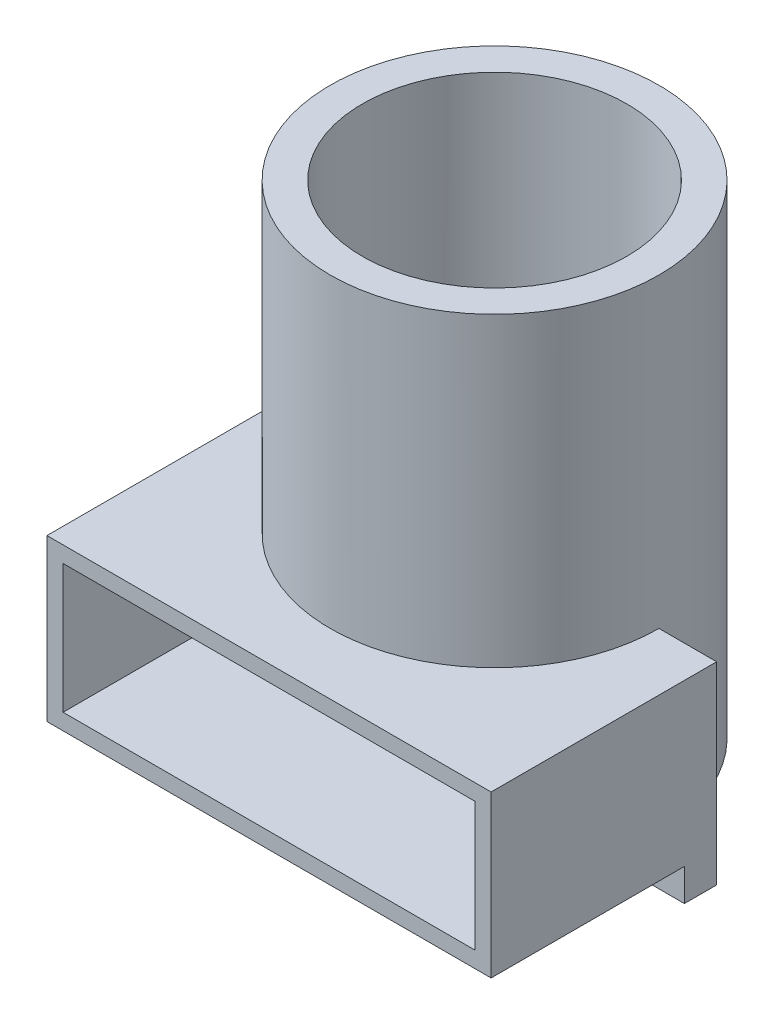
ISO-10303-21;
HEADER;
FILE_DESCRIPTION(('STEP AP214'),'2;1');
FILE_NAME('part.step','',(''),(''),'','','');
FILE_SCHEMA(('AUTOMOTIVE_DESIGN { 1 0 10303 214 1 1 1 1 }'));
ENDSEC;
DATA;
#1=APPLICATION_CONTEXT('core data for automotive mechanical design processes');
#2=APPLICATION_PROTOCOL_DEFINITION('international standard','automotive_design',2000,#1);
#3=PRODUCT_CONTEXT('',#1,'mechanical');
#4=PRODUCT('Part','Part','',(#3));
#5=PRODUCT_RELATED_PRODUCT_CATEGORY('part','',(#4));
#6=PRODUCT_DEFINITION_FORMATION('','',#4);
#7=PRODUCT_DEFINITION_CONTEXT('part definition',#1,'design');
#8=PRODUCT_DEFINITION('design','',#6,#7);
#9=PRODUCT_DEFINITION_SHAPE('','',#8);
#10=(LENGTH_UNIT() NAMED_UNIT(*) SI_UNIT(.MILLI.,.METRE.));
#11=(NAMED_UNIT(*) PLANE_ANGLE_UNIT() SI_UNIT($,.RADIAN.));
#12=(NAMED_UNIT(*) SI_UNIT($,.STERADIAN.) SOLID_ANGLE_UNIT());
#13=UNCERTAINTY_MEASURE_WITH_UNIT(LENGTH_MEASURE(1.E-05),#10,'distance_accuracy_value','');
#14=(GEOMETRIC_REPRESENTATION_CONTEXT(3) GLOBAL_UNCERTAINTY_ASSIGNED_CONTEXT((#13)) GLOBAL_UNIT_ASSIGNED_CONTEXT((#10,
#11,#12)) REPRESENTATION_CONTEXT('',''));
#15=CARTESIAN_POINT('',(0.,0.,0.));
#16=DIRECTION('',(0.,0.,1.));
#17=DIRECTION('',(1.,0.,0.));
#18=AXIS2_PLACEMENT_3D('',#15,#16,#17);
#19=CARTESIAN_POINT('',(-350.139,-254.,355.6));
#20=DIRECTION('',(0.,1.,0.));
#21=DIRECTION('',(0.,0.,1.));
#22=AXIS2_PLACEMENT_3D('',#19,#20,#21);
#23=PLANE('',#22);
#24=DIRECTION('',(-1.,0.,0.));
#25=VECTOR('',#24,1.);
#26=CARTESIAN_POINT('',(-350.139,-254.,50.8));
#27=LINE('',#26,#25);
#28=CARTESIAN_POINT('',(350.139,-254.,50.8000000000001));
#29=VERTEX_POINT('',#28);
#30=CARTESIAN_POINT('',(-350.139,-254.,50.8));
#31=VERTEX_POINT('',#30);
#32=EDGE_CURVE('E75',#29,#31,#27,.T.);
#33=ORIENTED_EDGE('',*,*,#32,.F.);
#34=DIRECTION('',(0.,0.,-1.));
#35=VECTOR('',#34,1.);
#36=CARTESIAN_POINT('',(350.139,-254.,355.6));
#37=LINE('',#36,#35);
#38=CARTESIAN_POINT('',(350.139,-254.,355.6));
#39=VERTEX_POINT('',#38);
#40=EDGE_CURVE('E247',#39,#29,#37,.T.);
#41=ORIENTED_EDGE('',*,*,#40,.F.);
#42=DIRECTION('',(1.,0.,0.));
#43=VECTOR('',#42,1.);
#44=CARTESIAN_POINT('',(-350.139,-254.,355.6));
#45=LINE('',#44,#43);
#46=CARTESIAN_POINT('',(-350.139,-254.,355.6));
#47=VERTEX_POINT('',#46);
#48=EDGE_CURVE('E232',#47,#39,#45,.T.);
#49=ORIENTED_EDGE('',*,*,#48,.F.);
#50=DIRECTION('',(0.,0.,-1.));
#51=VECTOR('',#50,1.);
#52=CARTESIAN_POINT('',(-350.139,-254.,355.6));
#53=LINE('',#52,#51);
#54=EDGE_CURVE('E71',#47,#31,#53,.T.);
#55=ORIENTED_EDGE('',*,*,#54,.T.);
#56=EDGE_LOOP('',(#33,#41,#49,#55));
#57=FACE_BOUND('',#56,.T.);
#58=ADVANCED_FACE('F51',(#57),#23,.F.);
#59=CARTESIAN_POINT('',(0.,482.6,0.));
#60=DIRECTION('',(0.,1.,0.));
#61=DIRECTION('',(0.,0.,1.));
#62=AXIS2_PLACEMENT_3D('',#59,#60,#61);
#63=PLANE('',#62);
#64=CARTESIAN_POINT('',(0.,482.6,0.));
#65=DIRECTION('',(0.,1.,0.));
#66=DIRECTION('',(0.,0.,1.));
#67=AXIS2_PLACEMENT_3D('',#64,#65,#66);
#68=CIRCLE('',#67,259.207);
#69=CARTESIAN_POINT('',(0.,482.6,259.207));
#70=VERTEX_POINT('',#69);
#71=EDGE_CURVE('E274',#70,#70,#68,.T.);
#72=ORIENTED_EDGE('',*,*,#71,.T.);
#73=EDGE_LOOP('',(#72));
#74=FACE_BOUND('',#73,.T.);
#75=CARTESIAN_POINT('',(0.,482.6,0.));
#76=DIRECTION('',(0.,1.,0.));
#77=DIRECTION('',(1.,0.,0.));
#78=AXIS2_PLACEMENT_3D('',#75,#76,#77);
#79=CIRCLE('',#78,208.407);
#80=CARTESIAN_POINT('',(208.407,482.6,0.));
#81=VERTEX_POINT('',#80);
#82=EDGE_CURVE('E268',#81,#81,#79,.T.);
#83=ORIENTED_EDGE('',*,*,#82,.F.);
#84=EDGE_LOOP('',(#83));
#85=FACE_BOUND('',#84,.T.);
#86=ADVANCED_FACE('F297',(#74,#85),#63,.T.);
#87=CARTESIAN_POINT('',(0.,482.6,0.));
#88=DIRECTION('',(0.,-1.,0.));
#89=DIRECTION('',(0.,0.,-1.));
#90=AXIS2_PLACEMENT_3D('',#87,#88,#89);
#91=CYLINDRICAL_SURFACE('',#90,259.207);
#92=ORIENTED_EDGE('',*,*,#71,.F.);
#93=EDGE_LOOP('',(#92));
#94=FACE_BOUND('',#93,.T.);
#95=CARTESIAN_POINT('',(0.,0.,0.));
#96=DIRECTION('',(0.,1.,0.));
#97=DIRECTION('',(0.,0.,1.));
#98=AXIS2_PLACEMENT_3D('',#95,#96,#97);
#99=CIRCLE('',#98,259.207);
#100=CARTESIAN_POINT('',(-259.207,0.,0.));
#101=VERTEX_POINT('',#100);
#102=CARTESIAN_POINT('',(259.207,0.,0.));
#103=VERTEX_POINT('',#102);
#104=EDGE_CURVE('E271',#101,#103,#99,.T.);
#105=ORIENTED_EDGE('',*,*,#104,.T.);
#106=DIRECTION('',(0.,1.,0.));
#107=VECTOR('',#106,1.);
#108=CARTESIAN_POINT('',(259.207,-279.4,0.));
#109=LINE('',#108,#107);
#110=CARTESIAN_POINT('',(259.207,-279.4,0.));
#111=VERTEX_POINT('',#110);
#112=EDGE_CURVE('E260',#111,#103,#109,.T.);
#113=ORIENTED_EDGE('',*,*,#112,.F.);
#114=CARTESIAN_POINT('',(0.,-279.4,0.));
#115=DIRECTION('',(0.,1.,0.));
#116=DIRECTION('',(1.,0.,0.));
#117=AXIS2_PLACEMENT_3D('',#114,#115,#116);
#118=CIRCLE('',#117,259.207);
#119=CARTESIAN_POINT('',(-259.207,-279.4,0.));
#120=VERTEX_POINT('',#119);
#121=EDGE_CURVE('E250',#111,#120,#118,.T.);
#122=ORIENTED_EDGE('',*,*,#121,.T.);
#123=DIRECTION('',(0.,1.,0.));
#124=VECTOR('',#123,1.);
#125=CARTESIAN_POINT('',(-259.207,-279.4,0.));
#126=LINE('',#125,#124);
#127=EDGE_CURVE('E259',#120,#101,#126,.T.);
#128=ORIENTED_EDGE('',*,*,#127,.T.);
#129=EDGE_LOOP('',(#105,#113,#122,#128));
#130=FACE_BOUND('',#129,.T.);
#131=ADVANCED_FACE('F294',(#94,#130),#91,.T.);
#132=CARTESIAN_POINT('',(0.,482.6,0.));
#133=DIRECTION('',(0.,-1.,0.));
#134=DIRECTION('',(0.,0.,-1.));
#135=AXIS2_PLACEMENT_3D('',#132,#133,#134);
#136=CYLINDRICAL_SURFACE('',#135,208.407);
#137=ORIENTED_EDGE('',*,*,#82,.T.);
#138=EDGE_LOOP('',(#137));
#139=FACE_BOUND('',#138,.T.);
#140=CARTESIAN_POINT('',(0.,0.,0.));
#141=DIRECTION('',(0.,1.,0.));
#142=DIRECTION('',(1.,0.,0.));
#143=AXIS2_PLACEMENT_3D('',#140,#141,#142);
#144=CIRCLE('',#143,208.407);
#145=CARTESIAN_POINT('',(-165.240665845306,0.,127.));
#146=VERTEX_POINT('',#145);
#147=CARTESIAN_POINT('',(165.240665845306,0.,127.));
#148=VERTEX_POINT('',#147);
#149=EDGE_CURVE('E262',#146,#148,#144,.T.);
#150=ORIENTED_EDGE('',*,*,#149,.F.);
#151=CARTESIAN_POINT('',(-165.240665845306,0.,127.));
#152=CARTESIAN_POINT('',(-166.311932556841,1.21420941249425E-05,125.606218523947));
#153=CARTESIAN_POINT('',(-167.365561715632,-0.0229447270909377,124.198784595822));
#154=CARTESIAN_POINT('',(-169.436248679135,-0.117403101078186,121.35864475642));
#155=CARTESIAN_POINT('',(-170.45330248051,-0.188909902964799,119.925936104136));
#156=CARTESIAN_POINT('',(-172.450099983005,-0.383152929945619,117.036438922352));
#157=CARTESIAN_POINT('',(-173.429813438047,-0.505929760738702,115.579632187488));
#158=CARTESIAN_POINT('',(-175.349675353412,-0.8052025581327,112.64564860846));
#159=CARTESIAN_POINT('',(-176.289825040983,-0.981696857045053,111.168472398037));
#160=CARTESIAN_POINT('',(-178.131706379324,-1.39130525163969,108.192619600541));
#161=CARTESIAN_POINT('',(-179.033330381572,-1.62456717293259,106.693896651353));
#162=CARTESIAN_POINT('',(-180.794289036789,-2.1496690869607,103.681945354611));
#163=CARTESIAN_POINT('',(-181.653624382415,-2.44150811984875,102.168717245126));
#164=CARTESIAN_POINT('',(-183.328723013307,-3.08568063064286,99.1315477465516));
#165=CARTESIAN_POINT('',(-184.14449716591,-3.43799892729679,97.6076091378119));
#166=CARTESIAN_POINT('',(-185.731779651966,-4.20492379997948,94.5523514245955));
#167=CARTESIAN_POINT('',(-186.503288073273,-4.61953025237883,93.0210323347735));
#168=CARTESIAN_POINT('',(-188.005393029706,-5.51492408139061,89.9466108711078));
#169=CARTESIAN_POINT('',(-188.735744008245,-5.99605941791235,88.4034897297044));
#170=CARTESIAN_POINT('',(-190.150459698756,-7.02394050163346,85.3179978200432));
#171=CARTESIAN_POINT('',(-190.834824321949,-7.57068637549255,83.7756270532398));
#172=CARTESIAN_POINT('',(-192.157388739441,-8.73066356069948,80.6958760423355));
#173=CARTESIAN_POINT('',(-192.795583764303,-9.34390172456619,79.1584963294468));
#174=CARTESIAN_POINT('',(-194.025765968894,-10.6372662950916,76.0934086076228));
#175=CARTESIAN_POINT('',(-194.617753254785,-11.3173925480686,74.5657005764744));
#176=CARTESIAN_POINT('',(-195.754601459759,-12.7430384393218,71.5278834139279));
#177=CARTESIAN_POINT('',(-196.299563226365,-13.4884108669848,70.017742950572));
#178=CARTESIAN_POINT('',(-197.344448603685,-15.0455332091651,67.0162037427374));
#179=CARTESIAN_POINT('',(-197.844372014055,-15.8572834189196,65.5248050816532));
#180=CARTESIAN_POINT('',(-198.800068852675,-17.5464313105003,62.5653901967699));
#181=CARTESIAN_POINT('',(-199.255845756859,-18.423823814234,61.0973721396845));
#182=CARTESIAN_POINT('',(-200.124506612406,-20.2433049736925,58.1890258166865));
#183=CARTESIAN_POINT('',(-200.537391326086,-21.1853924791068,56.7486970590264));
#184=CARTESIAN_POINT('',(-201.289363238606,-23.0524985110263,54.0176550367465));
#185=CARTESIAN_POINT('',(-201.631729056678,-23.9725003434789,52.7244098836027));
#186=CARTESIAN_POINT('',(-202.282950328475,-25.8646040839444,50.1679726001902));
#187=CARTESIAN_POINT('',(-202.591806355855,-26.8367050996461,48.9047799557421));
#188=CARTESIAN_POINT('',(-203.177481704608,-28.8315507955762,46.4115117426122));
#189=CARTESIAN_POINT('',(-203.454302718193,-29.8542927966723,45.1814344272866));
#190=CARTESIAN_POINT('',(-203.977548683471,-31.948904827191,42.7571638070158));
#191=CARTESIAN_POINT('',(-204.223973481575,-33.0207751048172,41.5629706834136));
#192=CARTESIAN_POINT('',(-204.688327694604,-35.2127451813163,39.2122764181573));
#193=CARTESIAN_POINT('',(-204.906235856449,-36.3328801340765,38.0558038656558));
#194=CARTESIAN_POINT('',(-205.315164127543,-38.6188126902771,35.7839793895387));
#195=CARTESIAN_POINT('',(-205.506184275841,-39.7846102273998,34.6686274062065));
#196=CARTESIAN_POINT('',(-205.86322812067,-42.1599841970612,32.4813326894888));
#197=CARTESIAN_POINT('',(-206.029251150858,-43.369561795572,31.409391113844));
#198=CARTESIAN_POINT('',(-206.33822292073,-45.8304749511302,29.3110907997537));
#199=CARTESIAN_POINT('',(-206.481171593592,-47.0818106290934,28.2847321933197));
#200=CARTESIAN_POINT('',(-206.747829332534,-49.6423105785045,26.2652778775167));
#201=CARTESIAN_POINT('',(-206.871235050754,-50.9520449562645,25.2728649975698));
#202=CARTESIAN_POINT('',(-207.098342872556,-53.6101629206216,23.3388532398886));
#203=CARTESIAN_POINT('',(-207.202044933025,-54.9585465917787,22.3972544733427));
#204=CARTESIAN_POINT('',(-207.391748487626,-57.6916524991079,20.5666496023786));
#205=CARTESIAN_POINT('',(-207.477750953356,-59.0763727359193,19.6776406130163));
#206=CARTESIAN_POINT('',(-207.634035860006,-61.8800726901625,17.9536634387054));
#207=CARTESIAN_POINT('',(-207.704316997375,-63.299055237691,17.1186997390565));
#208=CARTESIAN_POINT('',(-207.831072343026,-66.1691794286623,15.5041573057383));
#209=CARTESIAN_POINT('',(-207.88754364041,-67.6203277819727,14.7245902733474));
#210=CARTESIAN_POINT('',(-207.988495544094,-70.552182501091,13.2223349281151));
#211=CARTESIAN_POINT('',(-208.0329761073,-72.0328889731096,12.499646819702));
#212=CARTESIAN_POINT('',(-208.11169613546,-75.0216640370732,11.1122645815876));
#213=CARTESIAN_POINT('',(-208.145934635577,-76.5297351926848,10.4475759198171));
#214=CARTESIAN_POINT('',(-208.205806051121,-79.5706454634139,9.17737307791363));
#215=CARTESIAN_POINT('',(-208.231439452314,-81.1034831753208,8.57185555889806));
#216=CARTESIAN_POINT('',(-208.278831752784,-84.4150974759881,7.3376254966513));
#217=CARTESIAN_POINT('',(-208.29949355077,-86.1973711645665,6.71823159953031));
#218=CARTESIAN_POINT('',(-208.333642138568,-89.787832123275,5.55942459673572));
#219=CARTESIAN_POINT('',(-208.347128732695,-91.5960200987686,5.02001367267818));
#220=CARTESIAN_POINT('',(-208.368780445173,-95.2349164891828,4.02220033062723));
#221=CARTESIAN_POINT('',(-208.376944824328,-97.0656279964103,3.56380917181805));
#222=CARTESIAN_POINT('',(-208.389549203791,-100.745659635705,2.72904801142972));
#223=CARTESIAN_POINT('',(-208.393989214802,-102.594979714274,2.35267777412098));
#224=CARTESIAN_POINT('',(-208.40048007858,-106.310868419676,1.68228972570173));
#225=CARTESIAN_POINT('',(-208.402527956727,-108.177455618803,1.38837479196352));
#226=CARTESIAN_POINT('',(-208.40527719032,-111.921872062607,0.884105027288559));
#227=CARTESIAN_POINT('',(-208.405978540892,-113.79970134794,0.673750498721274));
#228=CARTESIAN_POINT('',(-208.406795865744,-117.56277739654,0.337035044424786));
#229=CARTESIAN_POINT('',(-208.406911891747,-119.448023489682,0.210666698054427));
#230=CARTESIAN_POINT('',(-208.406986550551,-122.278575526964,0.0842781353932177));
#231=CARTESIAN_POINT('',(-208.406994872219,-123.222568182027,0.0526759401650945));
#232=CARTESIAN_POINT('',(-208.407000334442,-125.111029813791,0.0105368699396677));
#233=CARTESIAN_POINT('',(-208.406997474921,-126.055498793608,1.34636531652082E-07));
#234=CARTESIAN_POINT('',(-208.407,-127.,0.));
#235=B_SPLINE_CURVE_WITH_KNOTS('',3,(#151,#152,#153,#154,#155,#156,#157,#158,#159,#160,#161,
#162,#163,#164,#165,#166,#167,#168,#169,#170,#171,#172,#173,#174,#175,#176,#177,#178,#179,#180,
#181,#182,#183,#184,#185,#186,#187,#188,#189,#190,#191,#192,#193,#194,#195,#196,#197,#198,#199,
#200,#201,#202,#203,#204,#205,#206,#207,#208,#209,#210,#211,#212,#213,#214,#215,#216,#217,#218,
#219,#220,#221,#222,#223,#224,#225,#226,#227,#228,#229,#230,#231,#232,#233,#234),.UNSPECIFIED.,
.F.,.F.,(4,2,2,2,2,2,2,2,2,2,2,2,2,2,2,2,2,2,2,2,2,2,2,2,2,2,2,2,2,2,2,2,2,2,2,2,2,2,2,2,2,4),
(0.,5.27354486485567,10.5476651970858,15.8259705618833,21.1041120754783,26.3961480228024,
31.6880972616671,36.9787200748017,42.2693323872565,47.5887432503667,52.9081643826491,
58.2281342423389,63.5480918791865,68.8563414586437,74.164614649575,79.4724695460645,
84.7802300905718,89.6496096545281,94.5189058464654,99.3879447057629,104.257008166919,
109.129680058798,114.002344874151,118.875139556349,123.747948349585,128.690227261686,
133.632516987749,138.574535340226,143.516963313743,148.460432177829,153.403918808397,
158.347870986564,163.291544028328,168.950455535937,174.609521367668,180.269373013243,
185.929208392089,191.596074311502,197.262960736698,202.92934639472,205.762708029656,
208.596088453776),.UNSPECIFIED.);
#236=CARTESIAN_POINT('',(-208.407,-127.,0.));
#237=VERTEX_POINT('',#236);
#238=EDGE_CURVE('E64',#146,#237,#235,.T.);
#239=ORIENTED_EDGE('',*,*,#238,.T.);
#240=DIRECTION('',(0.,1.,0.));
#241=VECTOR('',#240,1.);
#242=CARTESIAN_POINT('',(-208.407,-279.4,0.));
#243=LINE('',#242,#241);
#244=CARTESIAN_POINT('',(-208.407,-279.4,0.));
#245=VERTEX_POINT('',#244);
#246=EDGE_CURVE('E265',#245,#237,#243,.T.);
#247=ORIENTED_EDGE('',*,*,#246,.F.);
#248=CARTESIAN_POINT('',(0.,-279.4,0.));
#249=DIRECTION('',(0.,1.,0.));
#250=DIRECTION('',(0.,0.,1.));
#251=AXIS2_PLACEMENT_3D('',#248,#249,#250);
#252=CIRCLE('',#251,208.407);
#253=CARTESIAN_POINT('',(208.407,-279.4,0.));
#254=VERTEX_POINT('',#253);
#255=EDGE_CURVE('E255',#254,#245,#252,.T.);
#256=ORIENTED_EDGE('',*,*,#255,.F.);
#257=DIRECTION('',(0.,1.,0.));
#258=VECTOR('',#257,1.);
#259=CARTESIAN_POINT('',(208.407,-279.4,0.));
#260=LINE('',#259,#258);
#261=CARTESIAN_POINT('',(208.407,-127.,0.));
#262=VERTEX_POINT('',#261);
#263=EDGE_CURVE('E263',#254,#262,#260,.T.);
#264=ORIENTED_EDGE('',*,*,#263,.T.);
#265=CARTESIAN_POINT('',(208.407,-127.,0.));
#266=CARTESIAN_POINT('',(208.406956813777,-125.220599627466,-2.37077609889507E-05));
#267=CARTESIAN_POINT('',(208.406998497084,-123.441200960805,0.0373959524403046));
#268=CARTESIAN_POINT('',(208.406941126165,-119.885550758261,0.186951607964647));
#269=CARTESIAN_POINT('',(208.406842072312,-118.109299214056,0.299087405402571));
#270=CARTESIAN_POINT('',(208.406192763512,-114.563131968037,0.597900348014615));
#271=CARTESIAN_POINT('',(208.405642522422,-112.793216073329,0.784575203959295));
#272=CARTESIAN_POINT('',(208.403478660045,-109.262793123451,1.23212881877959));
#273=CARTESIAN_POINT('',(208.401865039565,-107.502286061163,1.49300752150162));
#274=CARTESIAN_POINT('',(208.396747585452,-103.993918880734,2.08848795922116));
#275=CARTESIAN_POINT('',(208.393243889461,-102.246057851056,2.42308432478208));
#276=CARTESIAN_POINT('',(208.383290017263,-98.7659357534716,3.16542001079952));
#277=CARTESIAN_POINT('',(208.376839825243,-97.0336747693311,3.57315972375795));
#278=CARTESIAN_POINT('',(208.359722122111,-93.5878571979298,4.46105039922734));
#279=CARTESIAN_POINT('',(208.349054671164,-91.8743003441914,4.94120032866277));
#280=CARTESIAN_POINT('',(208.32202611043,-88.4689129483997,5.97305806574803));
#281=CARTESIAN_POINT('',(208.305665001138,-86.7770824044628,6.52476586719395));
#282=CARTESIAN_POINT('',(208.265566038595,-83.4169854683924,7.69915996805016));
#283=CARTESIAN_POINT('',(208.241822992568,-81.7487365309425,8.32189603599572));
#284=CARTESIAN_POINT('',(208.185112454159,-78.440039381508,9.63689096255423));
#285=CARTESIAN_POINT('',(208.152145034408,-76.7995909507378,10.329149273741));
#286=CARTESIAN_POINT('',(208.074969614223,-73.5494256788914,11.7819254918786));
#287=CARTESIAN_POINT('',(208.030761372867,-71.9397094972906,12.5424448616336));
#288=CARTESIAN_POINT('',(207.928943035265,-68.7539996583379,14.1302922438981));
#289=CARTESIAN_POINT('',(207.871332943482,-67.1780059897568,14.9576202341608));
#290=CARTESIAN_POINT('',(207.740429553815,-64.0628456890542,16.6773836367239));
#291=CARTESIAN_POINT('',(207.667138041924,-62.5236748852697,17.5698116270158));
#292=CARTESIAN_POINT('',(207.502473794128,-59.4848704776224,19.4180783358247));
#293=CARTESIAN_POINT('',(207.411101044603,-57.9852369035436,20.373917102108));
#294=CARTESIAN_POINT('',(207.207799178032,-55.0283944789322,22.347016580271));
#295=CARTESIAN_POINT('',(207.095870386286,-53.571184957459,23.3642763199886));
#296=CARTESIAN_POINT('',(206.848921743655,-50.7019880681284,25.4580512003416));
#297=CARTESIAN_POINT('',(206.713901972873,-49.2900005434168,26.5345661354127));
#298=CARTESIAN_POINT('',(206.420429576776,-46.534860200383,28.7278530421396));
#299=CARTESIAN_POINT('',(206.262359353382,-45.1909920490095,29.8437775439054));
#300=CARTESIAN_POINT('',(205.918882305249,-42.5523831148755,32.1282695479214));
#301=CARTESIAN_POINT('',(205.733475559211,-41.2576421906924,33.2968368986073));
#302=CARTESIAN_POINT('',(205.332909126673,-38.7197692650481,35.6838703874822));
#303=CARTESIAN_POINT('',(205.117749355982,-37.4766374096348,36.9023366668601));
#304=CARTESIAN_POINT('',(204.655326372014,-35.0443640920192,39.3861749480685));
#305=CARTESIAN_POINT('',(204.408063181315,-33.8552225918465,40.6515469169099));
#306=CARTESIAN_POINT('',(203.879481246899,-31.5344875599381,43.2245024844447));
#307=CARTESIAN_POINT('',(203.598201467264,-30.4028302550236,44.5320365526224));
#308=CARTESIAN_POINT('',(202.999251181894,-28.1976804040096,47.1872203960553));
#309=CARTESIAN_POINT('',(202.681580581087,-27.1241880098761,48.5348702761059));
#310=CARTESIAN_POINT('',(202.007923123368,-25.0372955190319,51.2665134240505));
#311=CARTESIAN_POINT('',(201.651938353487,-24.0238921538389,52.6505047092708));
#312=CARTESIAN_POINT('',(200.89989412227,-22.0587549750587,55.4509881870703));
#313=CARTESIAN_POINT('',(200.503835193769,-21.1070203417874,56.8674799473229));
#314=CARTESIAN_POINT('',(199.694771215727,-19.3209820881066,59.6442953035071));
#315=CARTESIAN_POINT('',(199.284151486624,-18.4830624885951,61.0029901228901));
#316=CARTESIAN_POINT('',(198.425036301466,-16.863919226085,63.741999936599));
#317=CARTESIAN_POINT('',(197.976541317365,-16.0826948568453,65.1223146613495));
#318=CARTESIAN_POINT('',(197.040838185529,-14.5776046457056,67.9009182227799));
#319=CARTESIAN_POINT('',(196.553631117489,-13.8537372052214,69.2992065572574));
#320=CARTESIAN_POINT('',(195.539864485549,-12.463713680159,72.110132956762));
#321=CARTESIAN_POINT('',(195.013304766018,-11.7975578238404,73.5227710785205));
#322=CARTESIAN_POINT('',(193.919501160237,-10.521978069932,76.3611275796087));
#323=CARTESIAN_POINT('',(193.352189357587,-9.91265295918688,77.7868641713276));
#324=CARTESIAN_POINT('',(192.177503950788,-8.75184584604684,80.6453490100553));
#325=CARTESIAN_POINT('',(191.57013043972,-8.20036370926539,82.0780972407658));
#326=CARTESIAN_POINT('',(190.315390352067,-7.15480803849001,84.946929643426));
#327=CARTESIAN_POINT('',(189.668025557379,-6.66073194947033,86.3830136640024));
#328=CARTESIAN_POINT('',(188.333527024308,-5.72923048900095,89.255071163393));
#329=CARTESIAN_POINT('',(187.646392976271,-5.29180555873695,90.6910446412593));
#330=CARTESIAN_POINT('',(186.197673410583,-4.45227166873654,93.6307688290432));
#331=CARTESIAN_POINT('',(185.434085035998,-4.05299713636507,95.1343422775874));
#332=CARTESIAN_POINT('',(183.864283035052,-3.31436609334577,98.1339322427341));
#333=CARTESIAN_POINT('',(183.058068865904,-2.97501034592948,99.6299486628411));
#334=CARTESIAN_POINT('',(181.403685923509,-2.35445245643106,102.611342600974));
#335=CARTESIAN_POINT('',(180.555505549994,-2.07326650614758,104.09671704599));
#336=CARTESIAN_POINT('',(178.818429146178,-1.56725190145282,107.053195710315));
#337=CARTESIAN_POINT('',(177.929532469399,-1.34242414224221,108.524299702594));
#338=CARTESIAN_POINT('',(176.114103904229,-0.947440781998815,111.44618502736));
#339=CARTESIAN_POINT('',(175.187654734055,-0.777171667165227,112.897002469199));
#340=CARTESIAN_POINT('',(173.296600094192,-0.488409704918282,115.77882645205));
#341=CARTESIAN_POINT('',(172.331993462174,-0.369918436053235,117.209832387782));
#342=CARTESIAN_POINT('',(170.366740837458,-0.182425077172608,120.04844061563));
#343=CARTESIAN_POINT('',(169.366124235558,-0.113383547784221,121.456060682206));
#344=CARTESIAN_POINT('',(167.329571277011,-0.0221678350679159,124.246847763458));
#345=CARTESIAN_POINT('',(166.293638629275,1.12544670176697E-05,125.630017322915));
#346=CARTESIAN_POINT('',(165.240665845306,0.,127.));
#347=B_SPLINE_CURVE_WITH_KNOTS('',3,(#265,#266,#267,#268,#269,#270,#271,#272,#273,#274,#275,
#276,#277,#278,#279,#280,#281,#282,#283,#284,#285,#286,#287,#288,#289,#290,#291,#292,#293,#294,
#295,#296,#297,#298,#299,#300,#301,#302,#303,#304,#305,#306,#307,#308,#309,#310,#311,#312,#313,
#314,#315,#316,#317,#318,#319,#320,#321,#322,#323,#324,#325,#326,#327,#328,#329,#330,#331,#332,
#333,#334,#335,#336,#337,#338,#339,#340,#341,#342,#343,#344,#345,#346),.UNSPECIFIED.,.F.,.F.,(4,
2,2,2,2,2,2,2,2,2,2,2,2,2,2,2,2,2,2,2,2,2,2,2,2,2,2,2,2,2,2,2,2,2,2,2,2,2,2,2,4),(0.,
5.33780529098229,10.6755964448837,16.013223678162,21.3508468722146,26.6880814136889,
32.0253445966931,37.3625316402428,42.6997182210719,48.0406677394367,53.3815752058467,
58.7225971528703,64.0636173213733,69.4040295124965,74.744445726514,80.0847774353667,
85.4250906190594,90.6851961975409,95.9452866325891,101.205391952072,106.46549357216,
111.71962611658,116.973772387679,122.227632602096,127.481422969288,132.424677569204,
137.367870581401,142.310925774294,147.254000516962,152.205513449579,157.157014878095,
162.108295840922,167.059615360824,172.256936573345,177.45432398336,182.653156166372,
187.852070923065,193.040097591105,198.228282415193,203.412324703769,208.595824228348),.UNSPECIFIED.);
#348=EDGE_CURVE('E14',#262,#148,#347,.T.);
#349=ORIENTED_EDGE('',*,*,#348,.T.);
#350=EDGE_LOOP('',(#150,#239,#247,#256,#264,#349));
#351=FACE_BOUND('',#350,.T.);
#352=ADVANCED_FACE('F288',(#139,#351),#136,.F.);
#353=CARTESIAN_POINT('',(0.,-279.4,0.));
#354=DIRECTION('',(0.,1.,0.));
#355=DIRECTION('',(1.,0.,0.));
#356=AXIS2_PLACEMENT_3D('',#353,#354,#355);
#357=PLANE('',#356);
#358=ORIENTED_EDGE('',*,*,#121,.F.);
#359=DIRECTION('',(-1.,0.,0.));
#360=VECTOR('',#359,1.);
#361=CARTESIAN_POINT('',(259.207,-279.4,0.));
#362=LINE('',#361,#360);
#363=EDGE_CURVE('E257',#111,#254,#362,.T.);
#364=ORIENTED_EDGE('',*,*,#363,.T.);
#365=ORIENTED_EDGE('',*,*,#255,.T.);
#366=DIRECTION('',(-1.,0.,0.));
#367=VECTOR('',#366,1.);
#368=CARTESIAN_POINT('',(-208.407,-279.4,0.));
#369=LINE('',#368,#367);
#370=EDGE_CURVE('E253',#245,#120,#369,.T.);
#371=ORIENTED_EDGE('',*,*,#370,.T.);
#372=EDGE_LOOP('',(#358,#364,#365,#371));
#373=FACE_BOUND('',#372,.T.);
#374=ADVANCED_FACE('F293',(#373),#357,.F.);
#375=CARTESIAN_POINT('',(0.,0.,0.));
#376=DIRECTION('',(0.,0.,1.));
#377=DIRECTION('',(1.,0.,0.));
#378=AXIS2_PLACEMENT_3D('',#375,#376,#377);
#379=PLANE('',#378);
#380=DIRECTION('',(-1.,0.,0.));
#381=VECTOR('',#380,1.);
#382=CARTESIAN_POINT('',(-350.139,0.,0.));
#383=LINE('',#382,#381);
#384=CARTESIAN_POINT('',(-350.139,0.,0.));
#385=VERTEX_POINT('',#384);
#386=EDGE_CURVE('E240',#101,#385,#383,.T.);
#387=ORIENTED_EDGE('',*,*,#386,.F.);
#388=ORIENTED_EDGE('',*,*,#127,.F.);
#389=ORIENTED_EDGE('',*,*,#370,.F.);
#390=ORIENTED_EDGE('',*,*,#246,.T.);
#391=DIRECTION('',(-1.,0.,0.));
#392=VECTOR('',#391,1.);
#393=CARTESIAN_POINT('',(0.,-127.,0.));
#394=LINE('',#393,#392);
#395=EDGE_CURVE('E282',#237,#262,#394,.F.);
#396=ORIENTED_EDGE('',*,*,#395,.T.);
#397=ORIENTED_EDGE('',*,*,#263,.F.);
#398=ORIENTED_EDGE('',*,*,#363,.F.);
#399=ORIENTED_EDGE('',*,*,#112,.T.);
#400=CARTESIAN_POINT('',(350.139,0.,0.));
#401=VERTEX_POINT('',#400);
#402=EDGE_CURVE('E233',#401,#103,#383,.T.);
#403=ORIENTED_EDGE('',*,*,#402,.F.);
#404=DIRECTION('',(0.,1.,0.));
#405=VECTOR('',#404,1.);
#406=CARTESIAN_POINT('',(350.139,0.,0.));
#407=LINE('',#406,#405);
#408=CARTESIAN_POINT('',(350.139,-304.8,0.));
#409=VERTEX_POINT('',#408);
#410=EDGE_CURVE('E173',#409,#401,#407,.T.);
#411=ORIENTED_EDGE('',*,*,#410,.F.);
#412=DIRECTION('',(1.,0.,0.));
#413=VECTOR('',#412,1.);
#414=CARTESIAN_POINT('',(-350.139,-304.8,0.));
#415=LINE('',#414,#413);
#416=CARTESIAN_POINT('',(-350.139,-304.8,0.));
#417=VERTEX_POINT('',#416);
#418=EDGE_CURVE('E177',#417,#409,#415,.T.);
#419=ORIENTED_EDGE('',*,*,#418,.F.);
#420=DIRECTION('',(0.,-1.,0.));
#421=VECTOR('',#420,1.);
#422=CARTESIAN_POINT('',(-350.139,0.,0.));
#423=LINE('',#422,#421);
#424=EDGE_CURVE('E162',#385,#417,#423,.T.);
#425=ORIENTED_EDGE('',*,*,#424,.F.);
#426=EDGE_LOOP('',(#387,#388,#389,#390,#396,#397,#398,#399,#403,#411,#419,#425));
#427=FACE_BOUND('',#426,.T.);
#428=ADVANCED_FACE('F178',(#427),#379,.F.);
#429=CARTESIAN_POINT('',(-350.139,0.,355.6));
#430=DIRECTION('',(0.,-1.,0.));
#431=DIRECTION('',(0.,0.,-1.));
#432=AXIS2_PLACEMENT_3D('',#429,#430,#431);
#433=PLANE('',#432);
#434=ORIENTED_EDGE('',*,*,#402,.T.);
#435=ORIENTED_EDGE('',*,*,#104,.F.);
#436=ORIENTED_EDGE('',*,*,#386,.T.);
#437=DIRECTION('',(0.,0.,-1.));
#438=VECTOR('',#437,1.);
#439=CARTESIAN_POINT('',(-350.139,0.,355.6));
#440=LINE('',#439,#438);
#441=CARTESIAN_POINT('',(-350.139,0.,355.6));
#442=VERTEX_POINT('',#441);
#443=EDGE_CURVE('E170',#442,#385,#440,.T.);
#444=ORIENTED_EDGE('',*,*,#443,.F.);
#445=DIRECTION('',(-1.,0.,0.));
#446=VECTOR('',#445,1.);
#447=CARTESIAN_POINT('',(-350.139,0.,355.6));
#448=LINE('',#447,#446);
#449=CARTESIAN_POINT('',(350.139,0.,355.6));
#450=VERTEX_POINT('',#449);
#451=EDGE_CURVE('E237',#450,#442,#448,.T.);
#452=ORIENTED_EDGE('',*,*,#451,.F.);
#453=DIRECTION('',(0.,0.,-1.));
#454=VECTOR('',#453,1.);
#455=CARTESIAN_POINT('',(350.139,0.,355.6));
#456=LINE('',#455,#454);
#457=EDGE_CURVE('E244',#450,#401,#456,.T.);
#458=ORIENTED_EDGE('',*,*,#457,.T.);
#459=EDGE_LOOP('',(#434,#435,#436,#444,#452,#458));
#460=FACE_BOUND('',#459,.T.);
#461=ADVANCED_FACE('F316',(#460),#433,.F.);
#462=CARTESIAN_POINT('',(-350.139,0.,355.6));
#463=DIRECTION('',(1.,0.,0.));
#464=DIRECTION('',(0.,0.,-1.));
#465=AXIS2_PLACEMENT_3D('',#462,#463,#464);
#466=PLANE('',#465);
#467=ORIENTED_EDGE('',*,*,#424,.T.);
#468=DIRECTION('',(0.,0.,-1.));
#469=VECTOR('',#468,1.);
#470=CARTESIAN_POINT('',(-350.139,-304.8,0.));
#471=LINE('',#470,#469);
#472=CARTESIAN_POINT('',(-350.139,-304.8,50.8));
#473=VERTEX_POINT('',#472);
#474=EDGE_CURVE('E167',#473,#417,#471,.T.);
#475=ORIENTED_EDGE('',*,*,#474,.F.);
#476=DIRECTION('',(0.,1.,0.));
#477=VECTOR('',#476,1.);
#478=CARTESIAN_POINT('',(-350.139,-304.8,50.8));
#479=LINE('',#478,#477);
#480=EDGE_CURVE('E192',#473,#31,#479,.T.);
#481=ORIENTED_EDGE('',*,*,#480,.T.);
#482=ORIENTED_EDGE('',*,*,#54,.F.);
#483=DIRECTION('',(0.,-1.,0.));
#484=VECTOR('',#483,1.);
#485=CARTESIAN_POINT('',(-350.139,0.,355.6));
#486=LINE('',#485,#484);
#487=EDGE_CURVE('E229',#442,#47,#486,.T.);
#488=ORIENTED_EDGE('',*,*,#487,.F.);
#489=ORIENTED_EDGE('',*,*,#443,.T.);
#490=EDGE_LOOP('',(#467,#475,#481,#482,#488,#489));
#491=FACE_BOUND('',#490,.T.);
#492=ADVANCED_FACE('F164',(#491),#466,.F.);
#493=CARTESIAN_POINT('',(350.139,0.,355.6));
#494=DIRECTION('',(-1.,0.,0.));
#495=DIRECTION('',(0.,0.,1.));
#496=AXIS2_PLACEMENT_3D('',#493,#494,#495);
#497=PLANE('',#496);
#498=ORIENTED_EDGE('',*,*,#410,.T.);
#499=ORIENTED_EDGE('',*,*,#457,.F.);
#500=DIRECTION('',(0.,1.,0.));
#501=VECTOR('',#500,1.);
#502=CARTESIAN_POINT('',(350.139,0.,355.6));
#503=LINE('',#502,#501);
#504=EDGE_CURVE('E235',#39,#450,#503,.T.);
#505=ORIENTED_EDGE('',*,*,#504,.F.);
#506=ORIENTED_EDGE('',*,*,#40,.T.);
#507=DIRECTION('',(0.,1.,0.));
#508=VECTOR('',#507,1.);
#509=CARTESIAN_POINT('',(350.139,-304.8,50.8));
#510=LINE('',#509,#508);
#511=CARTESIAN_POINT('',(350.139,-304.8,50.8));
#512=VERTEX_POINT('',#511);
#513=EDGE_CURVE('E195',#512,#29,#510,.T.);
#514=ORIENTED_EDGE('',*,*,#513,.F.);
#515=DIRECTION('',(0.,0.,1.));
#516=VECTOR('',#515,1.);
#517=CARTESIAN_POINT('',(350.139,-304.8,0.));
#518=LINE('',#517,#516);
#519=EDGE_CURVE('E182',#409,#512,#518,.T.);
#520=ORIENTED_EDGE('',*,*,#519,.F.);
#521=EDGE_LOOP('',(#498,#499,#505,#506,#514,#520));
#522=FACE_BOUND('',#521,.T.);
#523=ADVANCED_FACE('F313',(#522),#497,.F.);
#524=ORIENTED_EDGE('',*,*,#149,.T.);
#525=DIRECTION('',(-1.,0.,0.));
#526=VECTOR('',#525,1.);
#527=CARTESIAN_POINT('',(-350.139,0.,127.));
#528=LINE('',#527,#526);
#529=EDGE_CURVE('E277',#148,#146,#528,.T.);
#530=ORIENTED_EDGE('',*,*,#529,.T.);
#531=EDGE_LOOP('',(#524,#530));
#532=FACE_BOUND('',#531,.T.);
#533=ADVANCED_FACE('F321',(#532),#433,.F.);
#534=CARTESIAN_POINT('',(0.,0.,355.6));
#535=DIRECTION('',(0.,0.,1.));
#536=DIRECTION('',(1.,0.,0.));
#537=AXIS2_PLACEMENT_3D('',#534,#535,#536);
#538=PLANE('',#537);
#539=DIRECTION('',(0.,-1.,0.));
#540=VECTOR('',#539,1.);
#541=CARTESIAN_POINT('',(-324.739,-25.4,355.6));
#542=LINE('',#541,#540);
#543=CARTESIAN_POINT('',(-324.739,-25.4,355.6));
#544=VERTEX_POINT('',#543);
#545=CARTESIAN_POINT('',(-324.739,-228.6,355.6));
#546=VERTEX_POINT('',#545);
#547=EDGE_CURVE('E198',#544,#546,#542,.T.);
#548=ORIENTED_EDGE('',*,*,#547,.F.);
#549=DIRECTION('',(-1.,0.,0.));
#550=VECTOR('',#549,1.);
#551=CARTESIAN_POINT('',(-324.739,-25.4,355.6));
#552=LINE('',#551,#550);
#553=CARTESIAN_POINT('',(324.739,-25.4,355.6));
#554=VERTEX_POINT('',#553);
#555=EDGE_CURVE('E203',#554,#544,#552,.T.);
#556=ORIENTED_EDGE('',*,*,#555,.F.);
#557=DIRECTION('',(0.,1.,0.));
#558=VECTOR('',#557,1.);
#559=CARTESIAN_POINT('',(324.739,-25.4,355.6));
#560=LINE('',#559,#558);
#561=CARTESIAN_POINT('',(324.739,-228.6,355.6));
#562=VERTEX_POINT('',#561);
#563=EDGE_CURVE('E217',#562,#554,#560,.T.);
#564=ORIENTED_EDGE('',*,*,#563,.F.);
#565=DIRECTION('',(1.,0.,0.));
#566=VECTOR('',#565,1.);
#567=CARTESIAN_POINT('',(-324.739,-228.6,355.6));
#568=LINE('',#567,#566);
#569=EDGE_CURVE('E214',#546,#562,#568,.T.);
#570=ORIENTED_EDGE('',*,*,#569,.F.);
#571=EDGE_LOOP('',(#548,#556,#564,#570));
#572=FACE_BOUND('',#571,.T.);
#573=ORIENTED_EDGE('',*,*,#487,.T.);
#574=ORIENTED_EDGE('',*,*,#48,.T.);
#575=ORIENTED_EDGE('',*,*,#504,.T.);
#576=ORIENTED_EDGE('',*,*,#451,.T.);
#577=EDGE_LOOP('',(#573,#574,#575,#576));
#578=FACE_BOUND('',#577,.T.);
#579=ADVANCED_FACE('F330',(#572,#578),#538,.T.);
#580=CARTESIAN_POINT('',(-324.739,-25.4,76.2));
#581=DIRECTION('',(-1.,0.,0.));
#582=DIRECTION('',(0.,0.,1.));
#583=AXIS2_PLACEMENT_3D('',#580,#581,#582);
#584=PLANE('',#583);
#585=ORIENTED_EDGE('',*,*,#547,.T.);
#586=DIRECTION('',(0.,0.,1.));
#587=VECTOR('',#586,1.);
#588=CARTESIAN_POINT('',(-324.739,-228.6,76.2));
#589=LINE('',#588,#587);
#590=CARTESIAN_POINT('',(-324.739,-228.6,76.2));
#591=VERTEX_POINT('',#590);
#592=EDGE_CURVE('E212',#591,#546,#589,.T.);
#593=ORIENTED_EDGE('',*,*,#592,.F.);
#594=DIRECTION('',(0.,-1.,0.));
#595=VECTOR('',#594,1.);
#596=CARTESIAN_POINT('',(-324.739,-25.4,76.2));
#597=LINE('',#596,#595);
#598=CARTESIAN_POINT('',(-324.739,-25.4,76.2));
#599=VERTEX_POINT('',#598);
#600=EDGE_CURVE('E199',#599,#591,#597,.T.);
#601=ORIENTED_EDGE('',*,*,#600,.F.);
#602=DIRECTION('',(0.,0.,1.));
#603=VECTOR('',#602,1.);
#604=CARTESIAN_POINT('',(-324.739,-25.4,76.2));
#605=LINE('',#604,#603);
#606=EDGE_CURVE('E174',#599,#544,#605,.T.);
#607=ORIENTED_EDGE('',*,*,#606,.T.);
#608=EDGE_LOOP('',(#585,#593,#601,#607));
#609=FACE_BOUND('',#608,.T.);
#610=ADVANCED_FACE('F335',(#609),#584,.F.);
#611=CARTESIAN_POINT('',(-324.739,-25.4,76.2));
#612=DIRECTION('',(0.,1.,0.));
#613=DIRECTION('',(0.,0.,1.));
#614=AXIS2_PLACEMENT_3D('',#611,#612,#613);
#615=PLANE('',#614);
#616=ORIENTED_EDGE('',*,*,#555,.T.);
#617=ORIENTED_EDGE('',*,*,#606,.F.);
#618=DIRECTION('',(-1.,0.,0.));
#619=VECTOR('',#618,1.);
#620=CARTESIAN_POINT('',(-324.739,-25.4,76.2));
#621=LINE('',#620,#619);
#622=CARTESIAN_POINT('',(324.739,-25.4,76.2));
#623=VERTEX_POINT('',#622);
#624=EDGE_CURVE('E209',#623,#599,#621,.T.);
#625=ORIENTED_EDGE('',*,*,#624,.F.);
#626=DIRECTION('',(0.,0.,1.));
#627=VECTOR('',#626,1.);
#628=CARTESIAN_POINT('',(324.739,-25.4,76.2));
#629=LINE('',#628,#627);
#630=EDGE_CURVE('E223',#623,#554,#629,.T.);
#631=ORIENTED_EDGE('',*,*,#630,.T.);
#632=EDGE_LOOP('',(#616,#617,#625,#631));
#633=FACE_BOUND('',#632,.T.);
#634=ADVANCED_FACE('F373',(#633),#615,.F.);
#635=CARTESIAN_POINT('',(324.739,-25.4,76.2));
#636=DIRECTION('',(1.,0.,0.));
#637=DIRECTION('',(0.,1.,0.));
#638=AXIS2_PLACEMENT_3D('',#635,#636,#637);
#639=PLANE('',#638);
#640=ORIENTED_EDGE('',*,*,#563,.T.);
#641=ORIENTED_EDGE('',*,*,#630,.F.);
#642=DIRECTION('',(0.,1.,0.));
#643=VECTOR('',#642,1.);
#644=CARTESIAN_POINT('',(324.739,-25.4,76.2));
#645=LINE('',#644,#643);
#646=CARTESIAN_POINT('',(324.739,-228.6,76.2));
#647=VERTEX_POINT('',#646);
#648=EDGE_CURVE('E206',#647,#623,#645,.T.);
#649=ORIENTED_EDGE('',*,*,#648,.F.);
#650=DIRECTION('',(0.,0.,1.));
#651=VECTOR('',#650,1.);
#652=CARTESIAN_POINT('',(324.739,-228.6,76.2));
#653=LINE('',#652,#651);
#654=EDGE_CURVE('E225',#647,#562,#653,.T.);
#655=ORIENTED_EDGE('',*,*,#654,.T.);
#656=EDGE_LOOP('',(#640,#641,#649,#655));
#657=FACE_BOUND('',#656,.T.);
#658=ADVANCED_FACE('F376',(#657),#639,.F.);
#659=CARTESIAN_POINT('',(-324.739,-228.6,76.2));
#660=DIRECTION('',(0.,-1.,0.));
#661=DIRECTION('',(0.,0.,-1.));
#662=AXIS2_PLACEMENT_3D('',#659,#660,#661);
#663=PLANE('',#662);
#664=ORIENTED_EDGE('',*,*,#569,.T.);
#665=ORIENTED_EDGE('',*,*,#654,.F.);
#666=DIRECTION('',(1.,0.,0.));
#667=VECTOR('',#666,1.);
#668=CARTESIAN_POINT('',(-324.739,-228.6,76.2));
#669=LINE('',#668,#667);
#670=EDGE_CURVE('E202',#591,#647,#669,.T.);
#671=ORIENTED_EDGE('',*,*,#670,.F.);
#672=ORIENTED_EDGE('',*,*,#592,.T.);
#673=EDGE_LOOP('',(#664,#665,#671,#672));
#674=FACE_BOUND('',#673,.T.);
#675=ADVANCED_FACE('F371',(#674),#663,.F.);
#676=CARTESIAN_POINT('',(0.,0.,76.2));
#677=DIRECTION('',(0.,0.,1.));
#678=DIRECTION('',(1.,0.,0.));
#679=AXIS2_PLACEMENT_3D('',#676,#677,#678);
#680=PLANE('',#679);
#681=ORIENTED_EDGE('',*,*,#600,.T.);
#682=ORIENTED_EDGE('',*,*,#670,.T.);
#683=ORIENTED_EDGE('',*,*,#648,.T.);
#684=ORIENTED_EDGE('',*,*,#624,.T.);
#685=EDGE_LOOP('',(#681,#682,#683,#684));
#686=FACE_BOUND('',#685,.T.);
#687=ADVANCED_FACE('F367',(#686),#680,.T.);
#688=CARTESIAN_POINT('',(-350.139,-127.,127.));
#689=DIRECTION('',(-1.,0.,0.));
#690=DIRECTION('',(0.,0.,1.));
#691=AXIS2_PLACEMENT_3D('',#688,#689,#690);
#692=CYLINDRICAL_SURFACE('',#691,127.);
#693=ORIENTED_EDGE('',*,*,#348,.F.);
#694=ORIENTED_EDGE('',*,*,#395,.F.);
#695=ORIENTED_EDGE('',*,*,#238,.F.);
#696=ORIENTED_EDGE('',*,*,#529,.F.);
#697=EDGE_LOOP('',(#693,#694,#695,#696));
#698=FACE_BOUND('',#697,.T.);
#699=ADVANCED_FACE('F53',(#698),#692,.T.);
#700=CARTESIAN_POINT('',(-350.139,-304.8,50.8));
#701=DIRECTION('',(0.,0.,-1.));
#702=DIRECTION('',(-1.,0.,0.));
#703=AXIS2_PLACEMENT_3D('',#700,#701,#702);
#704=PLANE('',#703);
#705=ORIENTED_EDGE('',*,*,#32,.T.);
#706=ORIENTED_EDGE('',*,*,#480,.F.);
#707=DIRECTION('',(-1.,0.,0.));
#708=VECTOR('',#707,1.);
#709=CARTESIAN_POINT('',(-350.139,-304.8,50.8));
#710=LINE('',#709,#708);
#711=EDGE_CURVE('E186',#512,#473,#710,.T.);
#712=ORIENTED_EDGE('',*,*,#711,.F.);
#713=ORIENTED_EDGE('',*,*,#513,.T.);
#714=EDGE_LOOP('',(#705,#706,#712,#713));
#715=FACE_BOUND('',#714,.T.);
#716=ADVANCED_FACE('F358',(#715),#704,.F.);
#717=CARTESIAN_POINT('',(0.,-304.8,0.));
#718=DIRECTION('',(0.,1.,0.));
#719=DIRECTION('',(0.,0.,1.));
#720=AXIS2_PLACEMENT_3D('',#717,#718,#719);
#721=PLANE('',#720);
#722=ORIENTED_EDGE('',*,*,#474,.T.);
#723=ORIENTED_EDGE('',*,*,#418,.T.);
#724=ORIENTED_EDGE('',*,*,#519,.T.);
#725=ORIENTED_EDGE('',*,*,#711,.T.);
#726=EDGE_LOOP('',(#722,#723,#724,#725));
#727=FACE_BOUND('',#726,.T.);
#728=ADVANCED_FACE('F184',(#727),#721,.F.);
#729=CLOSED_SHELL('',(#58,#86,#131,#352,#374,#428,#461,#492,#523,#533,#579,#610,#634,#658,#675,
#687,#699,#716,#728));
#730=MANIFOLD_SOLID_BREP('B2',#729);
#731=ADVANCED_BREP_SHAPE_REPRESENTATION('',(#18,#730),#14);
#732=SHAPE_DEFINITION_REPRESENTATION(#9,#731);
ENDSEC;
END-ISO-10303-21;
